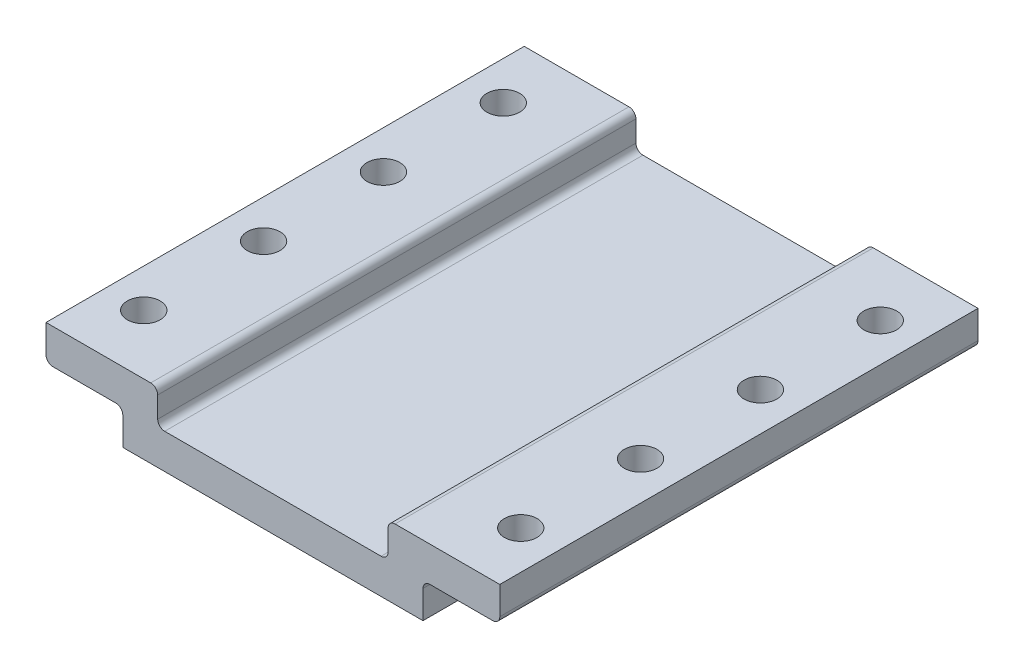
ISO-10303-21;
HEADER;
FILE_DESCRIPTION(('STEP AP214'),'2;1');
FILE_NAME('part.step','',(''),(''),'','','');
FILE_SCHEMA(('AUTOMOTIVE_DESIGN { 1 0 10303 214 1 1 1 1 }'));
ENDSEC;
DATA;
#1=APPLICATION_CONTEXT('core data for automotive mechanical design processes');
#2=APPLICATION_PROTOCOL_DEFINITION('international standard','automotive_design',2000,#1);
#3=PRODUCT_CONTEXT('',#1,'mechanical');
#4=PRODUCT('Part','Part','',(#3));
#5=PRODUCT_RELATED_PRODUCT_CATEGORY('part','',(#4));
#6=PRODUCT_DEFINITION_FORMATION('','',#4);
#7=PRODUCT_DEFINITION_CONTEXT('part definition',#1,'design');
#8=PRODUCT_DEFINITION('design','',#6,#7);
#9=PRODUCT_DEFINITION_SHAPE('','',#8);
#10=(LENGTH_UNIT() NAMED_UNIT(*) SI_UNIT(.MILLI.,.METRE.));
#11=(NAMED_UNIT(*) PLANE_ANGLE_UNIT() SI_UNIT($,.RADIAN.));
#12=(NAMED_UNIT(*) SI_UNIT($,.STERADIAN.) SOLID_ANGLE_UNIT());
#13=UNCERTAINTY_MEASURE_WITH_UNIT(LENGTH_MEASURE(1.E-05),#10,'distance_accuracy_value','');
#14=(GEOMETRIC_REPRESENTATION_CONTEXT(3) GLOBAL_UNCERTAINTY_ASSIGNED_CONTEXT((#13)) GLOBAL_UNIT_ASSIGNED_CONTEXT((#10,
#11,#12)) REPRESENTATION_CONTEXT('',''));
#15=CARTESIAN_POINT('',(0.,0.,0.));
#16=DIRECTION('',(0.,0.,1.));
#17=DIRECTION('',(1.,0.,0.));
#18=AXIS2_PLACEMENT_3D('',#15,#16,#17);
#19=CARTESIAN_POINT('',(-12.6060894386299,5.,-16.7354900095147));
#20=DIRECTION('',(1.,0.,0.));
#21=DIRECTION('',(0.,0.,-1.));
#22=AXIS2_PLACEMENT_3D('',#19,#20,#21);
#23=PLANE('',#22);
#24=DIRECTION('',(0.,-1.,0.));
#25=VECTOR('',#24,1.);
#26=CARTESIAN_POINT('',(-12.6060894386299,5.,51.7645099904853));
#27=LINE('',#26,#25);
#28=CARTESIAN_POINT('',(-12.6060894386299,4.,51.7645099904853));
#29=VERTEX_POINT('',#28);
#30=CARTESIAN_POINT('',(-12.6060894386299,0.,51.7645099904853));
#31=VERTEX_POINT('',#30);
#32=EDGE_CURVE('E315',#29,#31,#27,.T.);
#33=ORIENTED_EDGE('',*,*,#32,.F.);
#34=DIRECTION('',(0.,0.,1.));
#35=VECTOR('',#34,1.);
#36=CARTESIAN_POINT('',(-12.6060894386299,4.,-16.7354900095147));
#37=LINE('',#36,#35);
#38=CARTESIAN_POINT('',(-12.6060894386299,4.,-16.7354900095147));
#39=VERTEX_POINT('',#38);
#40=EDGE_CURVE('E392',#29,#39,#37,.F.);
#41=ORIENTED_EDGE('',*,*,#40,.T.);
#42=DIRECTION('',(0.,-1.,0.));
#43=VECTOR('',#42,1.);
#44=CARTESIAN_POINT('',(-12.6060894386299,5.,-16.7354900095147));
#45=LINE('',#44,#43);
#46=CARTESIAN_POINT('',(-12.6060894386299,0.,-16.7354900095147));
#47=VERTEX_POINT('',#46);
#48=EDGE_CURVE('E292',#39,#47,#45,.T.);
#49=ORIENTED_EDGE('',*,*,#48,.T.);
#50=DIRECTION('',(0.,0.,1.));
#51=VECTOR('',#50,1.);
#52=CARTESIAN_POINT('',(-12.6060894386299,0.,-16.7354900095147));
#53=LINE('',#52,#51);
#54=EDGE_CURVE('E282',#47,#31,#53,.T.);
#55=ORIENTED_EDGE('',*,*,#54,.T.);
#56=EDGE_LOOP('',(#33,#41,#49,#55));
#57=FACE_BOUND('',#56,.T.);
#58=ADVANCED_FACE('F44',(#57),#23,.F.);
#59=CARTESIAN_POINT('',(-12.6060894386299,5.,51.7645099904853));
#60=DIRECTION('',(0.,0.,-1.));
#61=DIRECTION('',(-1.,0.,0.));
#62=AXIS2_PLACEMENT_3D('',#59,#60,#61);
#63=PLANE('',#62);
#64=DIRECTION('',(-1.,0.,0.));
#65=VECTOR('',#64,1.);
#66=CARTESIAN_POINT('',(25.3939105613701,10.,51.7645099904853));
#67=LINE('',#66,#65);
#68=CARTESIAN_POINT('',(41.3939105613701,10.,51.7645099904853));
#69=VERTEX_POINT('',#68);
#70=CARTESIAN_POINT('',(26.3939105613701,10.,51.7645099904853));
#71=VERTEX_POINT('',#70);
#72=EDGE_CURVE('E185',#69,#71,#67,.T.);
#73=ORIENTED_EDGE('',*,*,#72,.T.);
#74=CARTESIAN_POINT('',(26.3939105613701,9.,51.7645099904853));
#75=DIRECTION('',(0.,0.,-1.));
#76=DIRECTION('',(-1.,0.,0.));
#77=AXIS2_PLACEMENT_3D('',#74,#75,#76);
#78=CIRCLE('',#77,1.);
#79=CARTESIAN_POINT('',(25.3939105613701,9.,51.7645099904853));
#80=VERTEX_POINT('',#79);
#81=EDGE_CURVE('E347',#71,#80,#78,.F.);
#82=ORIENTED_EDGE('',*,*,#81,.T.);
#83=DIRECTION('',(0.,-1.,0.));
#84=VECTOR('',#83,1.);
#85=CARTESIAN_POINT('',(25.3939105613701,10.,51.7645099904853));
#86=LINE('',#85,#84);
#87=CARTESIAN_POINT('',(25.3939105613701,6.,51.7645099904853));
#88=VERTEX_POINT('',#87);
#89=EDGE_CURVE('E193',#80,#88,#86,.T.);
#90=ORIENTED_EDGE('',*,*,#89,.T.);
#91=CARTESIAN_POINT('',(24.3939105613701,6.,51.7645099904853));
#92=DIRECTION('',(0.,0.,-1.));
#93=DIRECTION('',(-1.,0.,0.));
#94=AXIS2_PLACEMENT_3D('',#91,#92,#93);
#95=CIRCLE('',#94,1.);
#96=CARTESIAN_POINT('',(24.3939105613701,5.,51.7645099904853));
#97=VERTEX_POINT('',#96);
#98=EDGE_CURVE('E398',#88,#97,#95,.T.);
#99=ORIENTED_EDGE('',*,*,#98,.T.);
#100=DIRECTION('',(1.,0.,0.));
#101=VECTOR('',#100,1.);
#102=CARTESIAN_POINT('',(-12.6060894386299,5.,51.7645099904853));
#103=LINE('',#102,#101);
#104=CARTESIAN_POINT('',(-6.60608943862986,5.,51.7645099904853));
#105=VERTEX_POINT('',#104);
#106=EDGE_CURVE('E283',#105,#97,#103,.T.);
#107=ORIENTED_EDGE('',*,*,#106,.F.);
#108=CARTESIAN_POINT('',(-6.60608943862986,6.,51.7645099904853));
#109=DIRECTION('',(0.,0.,-1.));
#110=DIRECTION('',(-1.,0.,0.));
#111=AXIS2_PLACEMENT_3D('',#108,#109,#110);
#112=CIRCLE('',#111,1.);
#113=CARTESIAN_POINT('',(-7.60608943862986,6.,51.7645099904853));
#114=VERTEX_POINT('',#113);
#115=EDGE_CURVE('E404',#105,#114,#112,.T.);
#116=ORIENTED_EDGE('',*,*,#115,.T.);
#117=DIRECTION('',(0.,-1.,0.));
#118=VECTOR('',#117,1.);
#119=CARTESIAN_POINT('',(-7.60608943862986,10.,51.7645099904853));
#120=LINE('',#119,#118);
#121=CARTESIAN_POINT('',(-7.60608943862986,9.,51.7645099904853));
#122=VERTEX_POINT('',#121);
#123=EDGE_CURVE('E261',#122,#114,#120,.T.);
#124=ORIENTED_EDGE('',*,*,#123,.F.);
#125=CARTESIAN_POINT('',(-8.60608943862986,9.,51.7645099904853));
#126=DIRECTION('',(0.,0.,-1.));
#127=DIRECTION('',(-1.,0.,0.));
#128=AXIS2_PLACEMENT_3D('',#125,#126,#127);
#129=CIRCLE('',#128,1.);
#130=CARTESIAN_POINT('',(-8.60608943862986,10.,51.7645099904853));
#131=VERTEX_POINT('',#130);
#132=EDGE_CURVE('E344',#122,#131,#129,.F.);
#133=ORIENTED_EDGE('',*,*,#132,.T.);
#134=DIRECTION('',(1.,0.,0.));
#135=VECTOR('',#134,1.);
#136=CARTESIAN_POINT('',(-7.60608943862986,10.,51.7645099904853));
#137=LINE('',#136,#135);
#138=CARTESIAN_POINT('',(-23.6060894386299,10.,51.7645099904853));
#139=VERTEX_POINT('',#138);
#140=EDGE_CURVE('E257',#139,#131,#137,.T.);
#141=ORIENTED_EDGE('',*,*,#140,.F.);
#142=DIRECTION('',(0.,-1.,0.));
#143=VECTOR('',#142,1.);
#144=CARTESIAN_POINT('',(-23.6060894386299,10.,51.7645099904853));
#145=LINE('',#144,#143);
#146=CARTESIAN_POINT('',(-23.6060894386299,6.,51.7645099904853));
#147=VERTEX_POINT('',#146);
#148=EDGE_CURVE('E270',#139,#147,#145,.T.);
#149=ORIENTED_EDGE('',*,*,#148,.T.);
#150=CARTESIAN_POINT('',(-22.6060894386299,6.,51.7645099904853));
#151=DIRECTION('',(0.,0.,-1.));
#152=DIRECTION('',(-1.,0.,0.));
#153=AXIS2_PLACEMENT_3D('',#150,#151,#152);
#154=CIRCLE('',#153,1.);
#155=CARTESIAN_POINT('',(-22.6060894386299,5.,51.7645099904853));
#156=VERTEX_POINT('',#155);
#157=EDGE_CURVE('E339',#147,#156,#154,.F.);
#158=ORIENTED_EDGE('',*,*,#157,.T.);
#159=DIRECTION('',(1.,0.,0.));
#160=VECTOR('',#159,1.);
#161=CARTESIAN_POINT('',(-7.60608943862986,5.,51.7645099904853));
#162=LINE('',#161,#160);
#163=CARTESIAN_POINT('',(-13.6060894386299,5.,51.7645099904853));
#164=VERTEX_POINT('',#163);
#165=EDGE_CURVE('E254',#156,#164,#162,.T.);
#166=ORIENTED_EDGE('',*,*,#165,.T.);
#167=CARTESIAN_POINT('',(-13.6060894386299,4.,51.7645099904853));
#168=DIRECTION('',(0.,0.,-1.));
#169=DIRECTION('',(-1.,0.,0.));
#170=AXIS2_PLACEMENT_3D('',#167,#168,#169);
#171=CIRCLE('',#170,1.);
#172=EDGE_CURVE('E61',#164,#29,#171,.T.);
#173=ORIENTED_EDGE('',*,*,#172,.T.);
#174=ORIENTED_EDGE('',*,*,#32,.T.);
#175=DIRECTION('',(1.,0.,0.));
#176=VECTOR('',#175,1.);
#177=CARTESIAN_POINT('',(-12.6060894386299,0.,51.7645099904853));
#178=LINE('',#177,#176);
#179=CARTESIAN_POINT('',(30.3939105613701,0.,51.7645099904853));
#180=VERTEX_POINT('',#179);
#181=EDGE_CURVE('E296',#31,#180,#178,.T.);
#182=ORIENTED_EDGE('',*,*,#181,.T.);
#183=DIRECTION('',(0.,-1.,0.));
#184=VECTOR('',#183,1.);
#185=CARTESIAN_POINT('',(30.3939105613701,5.,51.7645099904853));
#186=LINE('',#185,#184);
#187=CARTESIAN_POINT('',(30.3939105613701,4.,51.7645099904853));
#188=VERTEX_POINT('',#187);
#189=EDGE_CURVE('E312',#188,#180,#186,.T.);
#190=ORIENTED_EDGE('',*,*,#189,.F.);
#191=CARTESIAN_POINT('',(31.3939105613701,4.,51.7645099904853));
#192=DIRECTION('',(0.,0.,-1.));
#193=DIRECTION('',(-1.,0.,0.));
#194=AXIS2_PLACEMENT_3D('',#191,#192,#193);
#195=CIRCLE('',#194,1.);
#196=CARTESIAN_POINT('',(31.3939105613701,5.,51.7645099904853));
#197=VERTEX_POINT('',#196);
#198=EDGE_CURVE('E410',#188,#197,#195,.T.);
#199=ORIENTED_EDGE('',*,*,#198,.T.);
#200=DIRECTION('',(-1.,0.,0.));
#201=VECTOR('',#200,1.);
#202=CARTESIAN_POINT('',(25.3939105613701,5.,51.7645099904853));
#203=LINE('',#202,#201);
#204=CARTESIAN_POINT('',(40.3939105613701,5.,51.7645099904853));
#205=VERTEX_POINT('',#204);
#206=EDGE_CURVE('E217',#205,#197,#203,.T.);
#207=ORIENTED_EDGE('',*,*,#206,.F.);
#208=CARTESIAN_POINT('',(40.3939105613701,6.,51.7645099904853));
#209=DIRECTION('',(0.,0.,-1.));
#210=DIRECTION('',(-1.,0.,0.));
#211=AXIS2_PLACEMENT_3D('',#208,#209,#210);
#212=CIRCLE('',#211,1.);
#213=CARTESIAN_POINT('',(41.3939105613701,6.,51.7645099904853));
#214=VERTEX_POINT('',#213);
#215=EDGE_CURVE('E188',#205,#214,#212,.F.);
#216=ORIENTED_EDGE('',*,*,#215,.T.);
#217=DIRECTION('',(0.,-1.,0.));
#218=VECTOR('',#217,1.);
#219=CARTESIAN_POINT('',(41.3939105613701,10.,51.7645099904853));
#220=LINE('',#219,#218);
#221=EDGE_CURVE('E182',#69,#214,#220,.T.);
#222=ORIENTED_EDGE('',*,*,#221,.F.);
#223=EDGE_LOOP('',(#73,#82,#90,#99,#107,#116,#124,#133,#141,#149,#158,#166,#173,#174,#182,#190,
#199,#207,#216,#222));
#224=FACE_BOUND('',#223,.T.);
#225=ADVANCED_FACE('F184',(#224),#63,.F.);
#226=CARTESIAN_POINT('',(30.3939105613701,5.,-16.7354900095147));
#227=DIRECTION('',(-1.,0.,0.));
#228=DIRECTION('',(0.,0.,1.));
#229=AXIS2_PLACEMENT_3D('',#226,#227,#228);
#230=PLANE('',#229);
#231=DIRECTION('',(0.,-1.,0.));
#232=VECTOR('',#231,1.);
#233=CARTESIAN_POINT('',(30.3939105613701,5.,-16.7354900095147));
#234=LINE('',#233,#232);
#235=CARTESIAN_POINT('',(30.3939105613701,4.,-16.7354900095147));
#236=VERTEX_POINT('',#235);
#237=CARTESIAN_POINT('',(30.3939105613701,0.,-16.7354900095147));
#238=VERTEX_POINT('',#237);
#239=EDGE_CURVE('E309',#236,#238,#234,.T.);
#240=ORIENTED_EDGE('',*,*,#239,.F.);
#241=DIRECTION('',(0.,0.,-1.));
#242=VECTOR('',#241,1.);
#243=CARTESIAN_POINT('',(30.3939105613701,4.,-16.7354900095147));
#244=LINE('',#243,#242);
#245=EDGE_CURVE('E379',#236,#188,#244,.F.);
#246=ORIENTED_EDGE('',*,*,#245,.T.);
#247=ORIENTED_EDGE('',*,*,#189,.T.);
#248=DIRECTION('',(0.,0.,-1.));
#249=VECTOR('',#248,1.);
#250=CARTESIAN_POINT('',(30.3939105613701,0.,-16.7354900095147));
#251=LINE('',#250,#249);
#252=EDGE_CURVE('E300',#180,#238,#251,.T.);
#253=ORIENTED_EDGE('',*,*,#252,.T.);
#254=EDGE_LOOP('',(#240,#246,#247,#253));
#255=FACE_BOUND('',#254,.T.);
#256=ADVANCED_FACE('F557',(#255),#230,.F.);
#257=CARTESIAN_POINT('',(-12.6060894386299,5.,-16.7354900095147));
#258=DIRECTION('',(0.,0.,1.));
#259=DIRECTION('',(1.,0.,0.));
#260=AXIS2_PLACEMENT_3D('',#257,#258,#259);
#261=PLANE('',#260);
#262=DIRECTION('',(0.,-1.,0.));
#263=VECTOR('',#262,1.);
#264=CARTESIAN_POINT('',(25.3939105613701,10.,-16.7354900095148));
#265=LINE('',#264,#263);
#266=CARTESIAN_POINT('',(25.3939105613701,9.,-16.7354900095148));
#267=VERTEX_POINT('',#266);
#268=CARTESIAN_POINT('',(25.3939105613701,6.,-16.7354900095148));
#269=VERTEX_POINT('',#268);
#270=EDGE_CURVE('E213',#267,#269,#265,.T.);
#271=ORIENTED_EDGE('',*,*,#270,.F.);
#272=CARTESIAN_POINT('',(26.3939105613701,9.,-16.7354900095147));
#273=DIRECTION('',(0.,0.,1.));
#274=DIRECTION('',(1.,0.,0.));
#275=AXIS2_PLACEMENT_3D('',#272,#273,#274);
#276=CIRCLE('',#275,1.);
#277=CARTESIAN_POINT('',(26.3939105613701,10.,-16.7354900095148));
#278=VERTEX_POINT('',#277);
#279=EDGE_CURVE('E334',#267,#278,#276,.F.);
#280=ORIENTED_EDGE('',*,*,#279,.T.);
#281=DIRECTION('',(1.,0.,0.));
#282=VECTOR('',#281,1.);
#283=CARTESIAN_POINT('',(25.3939105613701,10.,-16.7354900095148));
#284=LINE('',#283,#282);
#285=CARTESIAN_POINT('',(41.3939105613701,10.,-16.7354900095148));
#286=VERTEX_POINT('',#285);
#287=EDGE_CURVE('E210',#278,#286,#284,.T.);
#288=ORIENTED_EDGE('',*,*,#287,.T.);
#289=DIRECTION('',(0.,-1.,0.));
#290=VECTOR('',#289,1.);
#291=CARTESIAN_POINT('',(41.3939105613701,10.,-16.7354900095148));
#292=LINE('',#291,#290);
#293=CARTESIAN_POINT('',(41.3939105613701,6.,-16.7354900095148));
#294=VERTEX_POINT('',#293);
#295=EDGE_CURVE('E194',#286,#294,#292,.T.);
#296=ORIENTED_EDGE('',*,*,#295,.T.);
#297=CARTESIAN_POINT('',(40.3939105613701,6.,-16.7354900095147));
#298=DIRECTION('',(0.,0.,1.));
#299=DIRECTION('',(1.,0.,0.));
#300=AXIS2_PLACEMENT_3D('',#297,#298,#299);
#301=CIRCLE('',#300,1.);
#302=CARTESIAN_POINT('',(40.3939105613701,5.,-16.7354900095148));
#303=VERTEX_POINT('',#302);
#304=EDGE_CURVE('E328',#294,#303,#301,.F.);
#305=ORIENTED_EDGE('',*,*,#304,.T.);
#306=DIRECTION('',(1.,0.,0.));
#307=VECTOR('',#306,1.);
#308=CARTESIAN_POINT('',(25.3939105613701,5.,-16.7354900095148));
#309=LINE('',#308,#307);
#310=CARTESIAN_POINT('',(31.3939105613701,5.,-16.7354900095148));
#311=VERTEX_POINT('',#310);
#312=EDGE_CURVE('E204',#311,#303,#309,.T.);
#313=ORIENTED_EDGE('',*,*,#312,.F.);
#314=CARTESIAN_POINT('',(31.3939105613701,4.,-16.7354900095147));
#315=DIRECTION('',(0.,0.,1.));
#316=DIRECTION('',(1.,0.,0.));
#317=AXIS2_PLACEMENT_3D('',#314,#315,#316);
#318=CIRCLE('',#317,1.);
#319=EDGE_CURVE('E407',#311,#236,#318,.T.);
#320=ORIENTED_EDGE('',*,*,#319,.T.);
#321=ORIENTED_EDGE('',*,*,#239,.T.);
#322=DIRECTION('',(-1.,0.,0.));
#323=VECTOR('',#322,1.);
#324=CARTESIAN_POINT('',(-12.6060894386299,0.,-16.7354900095147));
#325=LINE('',#324,#323);
#326=EDGE_CURVE('E288',#238,#47,#325,.T.);
#327=ORIENTED_EDGE('',*,*,#326,.T.);
#328=ORIENTED_EDGE('',*,*,#48,.F.);
#329=CARTESIAN_POINT('',(-13.6060894386299,4.,-16.7354900095147));
#330=DIRECTION('',(0.,0.,1.));
#331=DIRECTION('',(1.,0.,0.));
#332=AXIS2_PLACEMENT_3D('',#329,#330,#331);
#333=CIRCLE('',#332,1.);
#334=CARTESIAN_POINT('',(-13.6060894386299,5.,-16.7354900095147));
#335=VERTEX_POINT('',#334);
#336=EDGE_CURVE('E415',#39,#335,#333,.T.);
#337=ORIENTED_EDGE('',*,*,#336,.T.);
#338=DIRECTION('',(-1.,0.,0.));
#339=VECTOR('',#338,1.);
#340=CARTESIAN_POINT('',(-7.60608943862987,5.,-16.7354900095147));
#341=LINE('',#340,#339);
#342=CARTESIAN_POINT('',(-22.6060894386299,5.,-16.7354900095147));
#343=VERTEX_POINT('',#342);
#344=EDGE_CURVE('E238',#335,#343,#341,.T.);
#345=ORIENTED_EDGE('',*,*,#344,.T.);
#346=CARTESIAN_POINT('',(-22.6060894386299,6.,-16.7354900095147));
#347=DIRECTION('',(0.,0.,1.));
#348=DIRECTION('',(1.,0.,0.));
#349=AXIS2_PLACEMENT_3D('',#346,#347,#348);
#350=CIRCLE('',#349,1.);
#351=CARTESIAN_POINT('',(-23.6060894386299,6.,-16.7354900095147));
#352=VERTEX_POINT('',#351);
#353=EDGE_CURVE('E325',#343,#352,#350,.F.);
#354=ORIENTED_EDGE('',*,*,#353,.T.);
#355=DIRECTION('',(0.,-1.,0.));
#356=VECTOR('',#355,1.);
#357=CARTESIAN_POINT('',(-23.6060894386299,10.,-16.7354900095147));
#358=LINE('',#357,#356);
#359=CARTESIAN_POINT('',(-23.6060894386299,10.,-16.7354900095147));
#360=VERTEX_POINT('',#359);
#361=EDGE_CURVE('E274',#360,#352,#358,.T.);
#362=ORIENTED_EDGE('',*,*,#361,.F.);
#363=DIRECTION('',(-1.,0.,0.));
#364=VECTOR('',#363,1.);
#365=CARTESIAN_POINT('',(-7.60608943862987,10.,-16.7354900095147));
#366=LINE('',#365,#364);
#367=CARTESIAN_POINT('',(-8.60608943862987,10.,-16.7354900095147));
#368=VERTEX_POINT('',#367);
#369=EDGE_CURVE('E250',#368,#360,#366,.T.);
#370=ORIENTED_EDGE('',*,*,#369,.F.);
#371=CARTESIAN_POINT('',(-8.60608943862987,9.,-16.7354900095147));
#372=DIRECTION('',(0.,0.,1.));
#373=DIRECTION('',(1.,0.,0.));
#374=AXIS2_PLACEMENT_3D('',#371,#372,#373);
#375=CIRCLE('',#374,1.);
#376=CARTESIAN_POINT('',(-7.60608943862987,9.,-16.7354900095147));
#377=VERTEX_POINT('',#376);
#378=EDGE_CURVE('E331',#368,#377,#375,.F.);
#379=ORIENTED_EDGE('',*,*,#378,.T.);
#380=DIRECTION('',(0.,-1.,0.));
#381=VECTOR('',#380,1.);
#382=CARTESIAN_POINT('',(-7.60608943862987,10.,-16.7354900095147));
#383=LINE('',#382,#381);
#384=CARTESIAN_POINT('',(-7.60608943862987,6.,-16.7354900095147));
#385=VERTEX_POINT('',#384);
#386=EDGE_CURVE('E278',#377,#385,#383,.T.);
#387=ORIENTED_EDGE('',*,*,#386,.T.);
#388=CARTESIAN_POINT('',(-6.60608943862987,6.,-16.7354900095147));
#389=DIRECTION('',(0.,0.,1.));
#390=DIRECTION('',(1.,0.,0.));
#391=AXIS2_PLACEMENT_3D('',#388,#389,#390);
#392=CIRCLE('',#391,1.);
#393=CARTESIAN_POINT('',(-6.60608943862987,5.,-16.7354900095147));
#394=VERTEX_POINT('',#393);
#395=EDGE_CURVE('E401',#385,#394,#392,.T.);
#396=ORIENTED_EDGE('',*,*,#395,.T.);
#397=DIRECTION('',(-1.,0.,0.));
#398=VECTOR('',#397,1.);
#399=CARTESIAN_POINT('',(-12.6060894386299,5.,-16.7354900095147));
#400=LINE('',#399,#398);
#401=CARTESIAN_POINT('',(24.3939105613701,5.,-16.7354900095147));
#402=VERTEX_POINT('',#401);
#403=EDGE_CURVE('E287',#402,#394,#400,.T.);
#404=ORIENTED_EDGE('',*,*,#403,.F.);
#405=CARTESIAN_POINT('',(24.3939105613701,6.,-16.7354900095147));
#406=DIRECTION('',(0.,0.,1.));
#407=DIRECTION('',(1.,0.,0.));
#408=AXIS2_PLACEMENT_3D('',#405,#406,#407);
#409=CIRCLE('',#408,1.);
#410=EDGE_CURVE('E395',#402,#269,#409,.T.);
#411=ORIENTED_EDGE('',*,*,#410,.T.);
#412=EDGE_LOOP('',(#271,#280,#288,#296,#305,#313,#320,#321,#327,#328,#337,#345,#354,#362,#370,
#379,#387,#396,#404,#411));
#413=FACE_BOUND('',#412,.T.);
#414=ADVANCED_FACE('F505',(#413),#261,.F.);
#415=CARTESIAN_POINT('',(0.,5.,0.));
#416=DIRECTION('',(0.,1.,0.));
#417=DIRECTION('',(0.,0.,1.));
#418=AXIS2_PLACEMENT_3D('',#415,#416,#417);
#419=PLANE('',#418);
#420=ORIENTED_EDGE('',*,*,#106,.T.);
#421=DIRECTION('',(0.,0.,-1.));
#422=VECTOR('',#421,1.);
#423=CARTESIAN_POINT('',(24.3939105613701,5.,-16.7354900095148));
#424=LINE('',#423,#422);
#425=EDGE_CURVE('E364',#97,#402,#424,.T.);
#426=ORIENTED_EDGE('',*,*,#425,.T.);
#427=ORIENTED_EDGE('',*,*,#403,.T.);
#428=DIRECTION('',(0.,0.,-1.));
#429=VECTOR('',#428,1.);
#430=CARTESIAN_POINT('',(-6.60608943862987,5.,0.));
#431=LINE('',#430,#429);
#432=EDGE_CURVE('E361',#394,#105,#431,.F.);
#433=ORIENTED_EDGE('',*,*,#432,.T.);
#434=EDGE_LOOP('',(#420,#426,#427,#433));
#435=FACE_BOUND('',#434,.T.);
#436=ADVANCED_FACE('F530',(#435),#419,.T.);
#437=CARTESIAN_POINT('',(0.,0.,0.));
#438=DIRECTION('',(0.,1.,0.));
#439=DIRECTION('',(0.,0.,1.));
#440=AXIS2_PLACEMENT_3D('',#437,#438,#439);
#441=PLANE('',#440);
#442=ORIENTED_EDGE('',*,*,#54,.F.);
#443=ORIENTED_EDGE('',*,*,#326,.F.);
#444=ORIENTED_EDGE('',*,*,#252,.F.);
#445=ORIENTED_EDGE('',*,*,#181,.F.);
#446=EDGE_LOOP('',(#442,#443,#444,#445));
#447=FACE_BOUND('',#446,.T.);
#448=ADVANCED_FACE('F563',(#447),#441,.F.);
#449=CARTESIAN_POINT('',(-7.60608943862987,10.,-16.7354900095147));
#450=DIRECTION('',(-1.,0.,0.));
#451=DIRECTION('',(0.,0.,1.));
#452=AXIS2_PLACEMENT_3D('',#449,#450,#451);
#453=PLANE('',#452);
#454=ORIENTED_EDGE('',*,*,#386,.F.);
#455=DIRECTION('',(0.,0.,-1.));
#456=VECTOR('',#455,1.);
#457=CARTESIAN_POINT('',(-7.60608943862987,9.,-16.7354900095147));
#458=LINE('',#457,#456);
#459=EDGE_CURVE('E358',#377,#122,#458,.F.);
#460=ORIENTED_EDGE('',*,*,#459,.T.);
#461=ORIENTED_EDGE('',*,*,#123,.T.);
#462=DIRECTION('',(0.,0.,-1.));
#463=VECTOR('',#462,1.);
#464=CARTESIAN_POINT('',(-7.60608943862987,6.,-16.7354900095147));
#465=LINE('',#464,#463);
#466=EDGE_CURVE('E354',#114,#385,#465,.T.);
#467=ORIENTED_EDGE('',*,*,#466,.T.);
#468=EDGE_LOOP('',(#454,#460,#461,#467));
#469=FACE_BOUND('',#468,.T.);
#470=ADVANCED_FACE('F518',(#469),#453,.F.);
#471=CARTESIAN_POINT('',(-23.6060894386299,10.,-16.7354900095147));
#472=DIRECTION('',(1.,0.,0.));
#473=DIRECTION('',(0.,0.,-1.));
#474=AXIS2_PLACEMENT_3D('',#471,#472,#473);
#475=PLANE('',#474);
#476=ORIENTED_EDGE('',*,*,#361,.T.);
#477=DIRECTION('',(0.,0.,1.));
#478=VECTOR('',#477,1.);
#479=CARTESIAN_POINT('',(-23.6060894386299,6.,51.7645099904853));
#480=LINE('',#479,#478);
#481=EDGE_CURVE('E382',#352,#147,#480,.T.);
#482=ORIENTED_EDGE('',*,*,#481,.T.);
#483=ORIENTED_EDGE('',*,*,#148,.F.);
#484=DIRECTION('',(0.,0.,1.));
#485=VECTOR('',#484,1.);
#486=CARTESIAN_POINT('',(-23.6060894386299,10.,-16.7354900095147));
#487=LINE('',#486,#485);
#488=EDGE_CURVE('E253',#360,#139,#487,.T.);
#489=ORIENTED_EDGE('',*,*,#488,.F.);
#490=EDGE_LOOP('',(#476,#482,#483,#489));
#491=FACE_BOUND('',#490,.T.);
#492=ADVANCED_FACE('F509',(#491),#475,.F.);
#493=CARTESIAN_POINT('',(0.,10.,0.));
#494=DIRECTION('',(0.,-1.,0.));
#495=DIRECTION('',(0.,0.,-1.));
#496=AXIS2_PLACEMENT_3D('',#493,#494,#495);
#497=PLANE('',#496);
#498=CARTESIAN_POINT('',(-18.1060894386299,10.,-8.23549000951475));
#499=DIRECTION('',(0.,1.,0.));
#500=DIRECTION('',(0.,0.,1.));
#501=AXIS2_PLACEMENT_3D('',#498,#499,#500);
#502=CIRCLE('',#501,2.35);
#503=CARTESIAN_POINT('',(-18.1060894386299,10.,-5.88549000951475));
#504=VERTEX_POINT('',#503);
#505=EDGE_CURVE('E234',#504,#504,#502,.T.);
#506=ORIENTED_EDGE('',*,*,#505,.F.);
#507=EDGE_LOOP('',(#506));
#508=FACE_BOUND('',#507,.T.);
#509=CARTESIAN_POINT('',(-18.1060894386299,10.,8.93117665715192));
#510=DIRECTION('',(0.,1.,0.));
#511=DIRECTION('',(0.,0.,1.));
#512=AXIS2_PLACEMENT_3D('',#509,#510,#511);
#513=CIRCLE('',#512,2.35);
#514=CARTESIAN_POINT('',(-18.1060894386299,10.,11.2811766571519));
#515=VERTEX_POINT('',#514);
#516=EDGE_CURVE('E239',#515,#515,#513,.T.);
#517=ORIENTED_EDGE('',*,*,#516,.F.);
#518=EDGE_LOOP('',(#517));
#519=FACE_BOUND('',#518,.T.);
#520=CARTESIAN_POINT('',(-18.1060894386299,10.,26.0978433238186));
#521=DIRECTION('',(0.,1.,0.));
#522=DIRECTION('',(0.,0.,1.));
#523=AXIS2_PLACEMENT_3D('',#520,#521,#522);
#524=CIRCLE('',#523,2.35);
#525=CARTESIAN_POINT('',(-18.1060894386299,10.,28.4478433238186));
#526=VERTEX_POINT('',#525);
#527=EDGE_CURVE('E243',#526,#526,#524,.T.);
#528=ORIENTED_EDGE('',*,*,#527,.F.);
#529=EDGE_LOOP('',(#528));
#530=FACE_BOUND('',#529,.T.);
#531=CARTESIAN_POINT('',(-18.1060894386299,10.,43.2645099904853));
#532=DIRECTION('',(0.,1.,0.));
#533=DIRECTION('',(0.,0.,1.));
#534=AXIS2_PLACEMENT_3D('',#531,#532,#533);
#535=CIRCLE('',#534,2.35);
#536=CARTESIAN_POINT('',(-18.1060894386299,10.,45.6145099904853));
#537=VERTEX_POINT('',#536);
#538=EDGE_CURVE('E233',#537,#537,#535,.T.);
#539=ORIENTED_EDGE('',*,*,#538,.F.);
#540=EDGE_LOOP('',(#539));
#541=FACE_BOUND('',#540,.T.);
#542=ORIENTED_EDGE('',*,*,#140,.T.);
#543=DIRECTION('',(0.,0.,-1.));
#544=VECTOR('',#543,1.);
#545=CARTESIAN_POINT('',(-8.60608943862987,10.,0.));
#546=LINE('',#545,#544);
#547=EDGE_CURVE('E350',#131,#368,#546,.T.);
#548=ORIENTED_EDGE('',*,*,#547,.T.);
#549=ORIENTED_EDGE('',*,*,#369,.T.);
#550=ORIENTED_EDGE('',*,*,#488,.T.);
#551=EDGE_LOOP('',(#542,#548,#549,#550));
#552=FACE_BOUND('',#551,.T.);
#553=ADVANCED_FACE('F490',(#508,#519,#530,#541,#552),#497,.F.);
#554=CARTESIAN_POINT('',(0.,5.,0.));
#555=DIRECTION('',(0.,-1.,0.));
#556=DIRECTION('',(0.,0.,-1.));
#557=AXIS2_PLACEMENT_3D('',#554,#555,#556);
#558=PLANE('',#557);
#559=CARTESIAN_POINT('',(-18.1060894386299,5.,-8.23549000951475));
#560=DIRECTION('',(0.,-1.,0.));
#561=DIRECTION('',(0.,0.,-1.));
#562=AXIS2_PLACEMENT_3D('',#559,#560,#561);
#563=CIRCLE('',#562,3.35000000000001);
#564=CARTESIAN_POINT('',(-18.1060894386299,5.,-11.5854900095148));
#565=VERTEX_POINT('',#564);
#566=EDGE_CURVE('E462',#565,#565,#563,.F.);
#567=ORIENTED_EDGE('',*,*,#566,.T.);
#568=EDGE_LOOP('',(#567));
#569=FACE_BOUND('',#568,.T.);
#570=CARTESIAN_POINT('',(-18.1060894386299,5.,8.93117665715192));
#571=DIRECTION('',(0.,-1.,0.));
#572=DIRECTION('',(0.,0.,-1.));
#573=AXIS2_PLACEMENT_3D('',#570,#571,#572);
#574=CIRCLE('',#573,3.35000000000001);
#575=CARTESIAN_POINT('',(-18.1060894386299,5.,5.58117665715191));
#576=VERTEX_POINT('',#575);
#577=EDGE_CURVE('E458',#576,#576,#574,.F.);
#578=ORIENTED_EDGE('',*,*,#577,.T.);
#579=EDGE_LOOP('',(#578));
#580=FACE_BOUND('',#579,.T.);
#581=CARTESIAN_POINT('',(-18.1060894386299,5.,26.0978433238186));
#582=DIRECTION('',(0.,-1.,0.));
#583=DIRECTION('',(0.,0.,-1.));
#584=AXIS2_PLACEMENT_3D('',#581,#582,#583);
#585=CIRCLE('',#584,3.35000000000001);
#586=CARTESIAN_POINT('',(-18.1060894386299,5.,22.7478433238186));
#587=VERTEX_POINT('',#586);
#588=EDGE_CURVE('E454',#587,#587,#585,.F.);
#589=ORIENTED_EDGE('',*,*,#588,.T.);
#590=EDGE_LOOP('',(#589));
#591=FACE_BOUND('',#590,.T.);
#592=CARTESIAN_POINT('',(-18.1060894386299,5.,43.2645099904853));
#593=DIRECTION('',(0.,-1.,0.));
#594=DIRECTION('',(0.,0.,-1.));
#595=AXIS2_PLACEMENT_3D('',#592,#593,#594);
#596=CIRCLE('',#595,3.35000000000001);
#597=CARTESIAN_POINT('',(-18.1060894386299,5.,39.9145099904853));
#598=VERTEX_POINT('',#597);
#599=EDGE_CURVE('E450',#598,#598,#596,.F.);
#600=ORIENTED_EDGE('',*,*,#599,.T.);
#601=EDGE_LOOP('',(#600));
#602=FACE_BOUND('',#601,.T.);
#603=ORIENTED_EDGE('',*,*,#165,.F.);
#604=DIRECTION('',(0.,0.,1.));
#605=VECTOR('',#604,1.);
#606=CARTESIAN_POINT('',(-22.6060894386299,5.,-16.7354900095147));
#607=LINE('',#606,#605);
#608=EDGE_CURVE('E389',#156,#343,#607,.F.);
#609=ORIENTED_EDGE('',*,*,#608,.T.);
#610=ORIENTED_EDGE('',*,*,#344,.F.);
#611=DIRECTION('',(0.,0.,1.));
#612=VECTOR('',#611,1.);
#613=CARTESIAN_POINT('',(-13.6060894386299,5.,0.));
#614=LINE('',#613,#612);
#615=EDGE_CURVE('E386',#335,#164,#614,.T.);
#616=ORIENTED_EDGE('',*,*,#615,.T.);
#617=EDGE_LOOP('',(#603,#609,#610,#616));
#618=FACE_BOUND('',#617,.T.);
#619=ADVANCED_FACE('F486',(#569,#580,#591,#602,#618),#558,.T.);
#620=CARTESIAN_POINT('',(-18.1060894386299,-0.000999999999999265,43.2645099904853));
#621=DIRECTION('',(0.,1.,0.));
#622=DIRECTION('',(0.,0.,1.));
#623=AXIS2_PLACEMENT_3D('',#620,#621,#622);
#624=CYLINDRICAL_SURFACE('',#623,2.35);
#625=CARTESIAN_POINT('',(-18.1060894386299,6.00000000000003,43.2645099904853));
#626=DIRECTION('',(0.,-1.,0.));
#627=DIRECTION('',(0.,0.,-1.));
#628=AXIS2_PLACEMENT_3D('',#625,#626,#627);
#629=CIRCLE('',#628,2.35);
#630=CARTESIAN_POINT('',(-18.1060894386299,6.00000000000003,40.9145099904853));
#631=VERTEX_POINT('',#630);
#632=EDGE_CURVE('E11',#631,#631,#629,.T.);
#633=ORIENTED_EDGE('',*,*,#632,.T.);
#634=EDGE_LOOP('',(#633));
#635=FACE_BOUND('',#634,.T.);
#636=ORIENTED_EDGE('',*,*,#538,.T.);
#637=EDGE_LOOP('',(#636));
#638=FACE_BOUND('',#637,.T.);
#639=ADVANCED_FACE('F489',(#635,#638),#624,.F.);
#640=CARTESIAN_POINT('',(-18.1060894386299,-0.000999999999999265,26.0978433238186));
#641=DIRECTION('',(0.,1.,0.));
#642=DIRECTION('',(0.,0.,1.));
#643=AXIS2_PLACEMENT_3D('',#640,#641,#642);
#644=CYLINDRICAL_SURFACE('',#643,2.35);
#645=CARTESIAN_POINT('',(-18.1060894386299,6.00000000000001,26.0978433238186));
#646=DIRECTION('',(0.,-1.,0.));
#647=DIRECTION('',(0.,0.,-1.));
#648=AXIS2_PLACEMENT_3D('',#645,#646,#647);
#649=CIRCLE('',#648,2.35);
#650=CARTESIAN_POINT('',(-18.1060894386299,6.00000000000001,23.7478433238186));
#651=VERTEX_POINT('',#650);
#652=EDGE_CURVE('E54',#651,#651,#649,.T.);
#653=ORIENTED_EDGE('',*,*,#652,.T.);
#654=EDGE_LOOP('',(#653));
#655=FACE_BOUND('',#654,.T.);
#656=ORIENTED_EDGE('',*,*,#527,.T.);
#657=EDGE_LOOP('',(#656));
#658=FACE_BOUND('',#657,.T.);
#659=ADVANCED_FACE('F477',(#655,#658),#644,.F.);
#660=CARTESIAN_POINT('',(-18.1060894386299,-0.000999999999999265,8.93117665715192));
#661=DIRECTION('',(0.,1.,0.));
#662=DIRECTION('',(0.,0.,1.));
#663=AXIS2_PLACEMENT_3D('',#660,#661,#662);
#664=CYLINDRICAL_SURFACE('',#663,2.35);
#665=CARTESIAN_POINT('',(-18.1060894386299,6.00000000000001,8.93117665715192));
#666=DIRECTION('',(0.,-1.,0.));
#667=DIRECTION('',(0.,0.,-1.));
#668=AXIS2_PLACEMENT_3D('',#665,#666,#667);
#669=CIRCLE('',#668,2.35);
#670=CARTESIAN_POINT('',(-18.1060894386299,6.00000000000001,6.58117665715192));
#671=VERTEX_POINT('',#670);
#672=EDGE_CURVE('E470',#671,#671,#669,.T.);
#673=ORIENTED_EDGE('',*,*,#672,.T.);
#674=EDGE_LOOP('',(#673));
#675=FACE_BOUND('',#674,.T.);
#676=ORIENTED_EDGE('',*,*,#516,.T.);
#677=EDGE_LOOP('',(#676));
#678=FACE_BOUND('',#677,.T.);
#679=ADVANCED_FACE('F645',(#675,#678),#664,.F.);
#680=CARTESIAN_POINT('',(-18.1060894386299,-0.000999999999999265,-8.23549000951475));
#681=DIRECTION('',(0.,1.,0.));
#682=DIRECTION('',(0.,0.,1.));
#683=AXIS2_PLACEMENT_3D('',#680,#681,#682);
#684=CYLINDRICAL_SURFACE('',#683,2.35);
#685=CARTESIAN_POINT('',(-18.1060894386299,6.00000000000001,-8.23549000951475));
#686=DIRECTION('',(0.,-1.,0.));
#687=DIRECTION('',(0.,0.,-1.));
#688=AXIS2_PLACEMENT_3D('',#685,#686,#687);
#689=CIRCLE('',#688,2.35);
#690=CARTESIAN_POINT('',(-18.1060894386299,6.00000000000001,-10.5854900095147));
#691=VERTEX_POINT('',#690);
#692=EDGE_CURVE('E466',#691,#691,#689,.T.);
#693=ORIENTED_EDGE('',*,*,#692,.T.);
#694=EDGE_LOOP('',(#693));
#695=FACE_BOUND('',#694,.T.);
#696=ORIENTED_EDGE('',*,*,#505,.T.);
#697=EDGE_LOOP('',(#696));
#698=FACE_BOUND('',#697,.T.);
#699=ADVANCED_FACE('F648',(#695,#698),#684,.F.);
#700=CARTESIAN_POINT('',(17.7878211227403,5.,0.));
#701=DIRECTION('',(0.,-1.,0.));
#702=DIRECTION('',(0.,0.,-1.));
#703=AXIS2_PLACEMENT_3D('',#700,#701,#702);
#704=PLANE('',#703);
#705=CARTESIAN_POINT('',(35.8939105613701,5.,-8.23549000951475));
#706=DIRECTION('',(0.,-1.,0.));
#707=DIRECTION('',(0.,0.,-1.));
#708=AXIS2_PLACEMENT_3D('',#705,#706,#707);
#709=CIRCLE('',#708,3.34999999999998);
#710=CARTESIAN_POINT('',(35.8939105613701,5.,-11.5854900095147));
#711=VERTEX_POINT('',#710);
#712=EDGE_CURVE('E434',#711,#711,#709,.F.);
#713=ORIENTED_EDGE('',*,*,#712,.T.);
#714=EDGE_LOOP('',(#713));
#715=FACE_BOUND('',#714,.T.);
#716=CARTESIAN_POINT('',(35.8939105613701,5.,8.93117665715191));
#717=DIRECTION('',(0.,-1.,0.));
#718=DIRECTION('',(0.,0.,-1.));
#719=AXIS2_PLACEMENT_3D('',#716,#717,#718);
#720=CIRCLE('',#719,3.34999999999998);
#721=CARTESIAN_POINT('',(35.8939105613701,5.,5.58117665715194));
#722=VERTEX_POINT('',#721);
#723=EDGE_CURVE('E430',#722,#722,#720,.F.);
#724=ORIENTED_EDGE('',*,*,#723,.T.);
#725=EDGE_LOOP('',(#724));
#726=FACE_BOUND('',#725,.T.);
#727=CARTESIAN_POINT('',(35.8939105613701,5.,26.0978433238186));
#728=DIRECTION('',(0.,-1.,0.));
#729=DIRECTION('',(0.,0.,-1.));
#730=AXIS2_PLACEMENT_3D('',#727,#728,#729);
#731=CIRCLE('',#730,3.35000000000001);
#732=CARTESIAN_POINT('',(35.8939105613701,5.,22.7478433238186));
#733=VERTEX_POINT('',#732);
#734=EDGE_CURVE('E426',#733,#733,#731,.F.);
#735=ORIENTED_EDGE('',*,*,#734,.T.);
#736=EDGE_LOOP('',(#735));
#737=FACE_BOUND('',#736,.T.);
#738=CARTESIAN_POINT('',(35.8939105613701,5.,43.2645099904853));
#739=DIRECTION('',(0.,-1.,0.));
#740=DIRECTION('',(0.,0.,-1.));
#741=AXIS2_PLACEMENT_3D('',#738,#739,#740);
#742=CIRCLE('',#741,3.35000000000001);
#743=CARTESIAN_POINT('',(35.8939105613701,5.,39.9145099904852));
#744=VERTEX_POINT('',#743);
#745=EDGE_CURVE('E422',#744,#744,#742,.F.);
#746=ORIENTED_EDGE('',*,*,#745,.T.);
#747=EDGE_LOOP('',(#746));
#748=FACE_BOUND('',#747,.T.);
#749=ORIENTED_EDGE('',*,*,#312,.T.);
#750=DIRECTION('',(0.,0.,1.));
#751=VECTOR('',#750,1.);
#752=CARTESIAN_POINT('',(40.3939105613701,5.,0.));
#753=LINE('',#752,#751);
#754=EDGE_CURVE('E372',#303,#205,#753,.T.);
#755=ORIENTED_EDGE('',*,*,#754,.T.);
#756=ORIENTED_EDGE('',*,*,#206,.T.);
#757=DIRECTION('',(0.,0.,-1.));
#758=VECTOR('',#757,1.);
#759=CARTESIAN_POINT('',(31.3939105613701,5.,0.));
#760=LINE('',#759,#758);
#761=EDGE_CURVE('E368',#197,#311,#760,.T.);
#762=ORIENTED_EDGE('',*,*,#761,.T.);
#763=EDGE_LOOP('',(#749,#755,#756,#762));
#764=FACE_BOUND('',#763,.T.);
#765=ADVANCED_FACE('F548',(#715,#726,#737,#748,#764),#704,.T.);
#766=CARTESIAN_POINT('',(25.3939105613701,10.,-16.7354900095148));
#767=DIRECTION('',(-1.,0.,0.));
#768=DIRECTION('',(0.,0.,1.));
#769=AXIS2_PLACEMENT_3D('',#766,#767,#768);
#770=PLANE('',#769);
#771=ORIENTED_EDGE('',*,*,#89,.F.);
#772=DIRECTION('',(0.,0.,-1.));
#773=VECTOR('',#772,1.);
#774=CARTESIAN_POINT('',(25.3939105613701,9.,-16.7354900095148));
#775=LINE('',#774,#773);
#776=EDGE_CURVE('E321',#80,#267,#775,.T.);
#777=ORIENTED_EDGE('',*,*,#776,.T.);
#778=ORIENTED_EDGE('',*,*,#270,.T.);
#779=DIRECTION('',(0.,0.,-1.));
#780=VECTOR('',#779,1.);
#781=CARTESIAN_POINT('',(25.3939105613701,6.,51.7645099904853));
#782=LINE('',#781,#780);
#783=EDGE_CURVE('E318',#269,#88,#782,.F.);
#784=ORIENTED_EDGE('',*,*,#783,.T.);
#785=EDGE_LOOP('',(#771,#777,#778,#784));
#786=FACE_BOUND('',#785,.T.);
#787=ADVANCED_FACE('F538',(#786),#770,.T.);
#788=CARTESIAN_POINT('',(41.3939105613701,10.,-16.7354900095148));
#789=DIRECTION('',(1.,0.,0.));
#790=DIRECTION('',(0.,0.,-1.));
#791=AXIS2_PLACEMENT_3D('',#788,#789,#790);
#792=PLANE('',#791);
#793=ORIENTED_EDGE('',*,*,#221,.T.);
#794=DIRECTION('',(0.,0.,1.));
#795=VECTOR('',#794,1.);
#796=CARTESIAN_POINT('',(41.3939105613701,6.,-16.7354900095148));
#797=LINE('',#796,#795);
#798=EDGE_CURVE('E376',#214,#294,#797,.F.);
#799=ORIENTED_EDGE('',*,*,#798,.T.);
#800=ORIENTED_EDGE('',*,*,#295,.F.);
#801=DIRECTION('',(0.,0.,1.));
#802=VECTOR('',#801,1.);
#803=CARTESIAN_POINT('',(41.3939105613701,10.,-16.7354900095148));
#804=LINE('',#803,#802);
#805=EDGE_CURVE('E200',#286,#69,#804,.T.);
#806=ORIENTED_EDGE('',*,*,#805,.T.);
#807=EDGE_LOOP('',(#793,#799,#800,#806));
#808=FACE_BOUND('',#807,.T.);
#809=ADVANCED_FACE('F207',(#808),#792,.T.);
#810=CARTESIAN_POINT('',(17.7878211227403,10.,0.));
#811=DIRECTION('',(0.,-1.,0.));
#812=DIRECTION('',(0.,0.,-1.));
#813=AXIS2_PLACEMENT_3D('',#810,#811,#812);
#814=PLANE('',#813);
#815=CARTESIAN_POINT('',(35.8939105613701,10.,-8.23549000951475));
#816=DIRECTION('',(0.,-1.,0.));
#817=DIRECTION('',(0.,0.,1.));
#818=AXIS2_PLACEMENT_3D('',#815,#816,#817);
#819=CIRCLE('',#818,2.35);
#820=CARTESIAN_POINT('',(35.8939105613701,10.,-5.88549000951475));
#821=VERTEX_POINT('',#820);
#822=EDGE_CURVE('E221',#821,#821,#819,.T.);
#823=ORIENTED_EDGE('',*,*,#822,.T.);
#824=EDGE_LOOP('',(#823));
#825=FACE_BOUND('',#824,.T.);
#826=CARTESIAN_POINT('',(35.8939105613701,10.,8.93117665715191));
#827=DIRECTION('',(0.,-1.,0.));
#828=DIRECTION('',(0.,0.,1.));
#829=AXIS2_PLACEMENT_3D('',#826,#827,#828);
#830=CIRCLE('',#829,2.35);
#831=CARTESIAN_POINT('',(35.8939105613701,10.,11.2811766571519));
#832=VERTEX_POINT('',#831);
#833=EDGE_CURVE('E1024',#832,#832,#830,.T.);
#834=ORIENTED_EDGE('',*,*,#833,.T.);
#835=EDGE_LOOP('',(#834));
#836=FACE_BOUND('',#835,.T.);
#837=CARTESIAN_POINT('',(35.8939105613701,10.,26.0978433238186));
#838=DIRECTION('',(0.,-1.,0.));
#839=DIRECTION('',(0.,0.,1.));
#840=AXIS2_PLACEMENT_3D('',#837,#838,#839);
#841=CIRCLE('',#840,2.35);
#842=CARTESIAN_POINT('',(35.8939105613701,10.,28.4478433238186));
#843=VERTEX_POINT('',#842);
#844=EDGE_CURVE('E1028',#843,#843,#841,.T.);
#845=ORIENTED_EDGE('',*,*,#844,.T.);
#846=EDGE_LOOP('',(#845));
#847=FACE_BOUND('',#846,.T.);
#848=CARTESIAN_POINT('',(35.8939105613701,10.,43.2645099904853));
#849=DIRECTION('',(0.,-1.,0.));
#850=DIRECTION('',(0.,0.,1.));
#851=AXIS2_PLACEMENT_3D('',#848,#849,#850);
#852=CIRCLE('',#851,2.35);
#853=CARTESIAN_POINT('',(35.8939105613701,10.,45.6145099904852));
#854=VERTEX_POINT('',#853);
#855=EDGE_CURVE('E1031',#854,#854,#852,.T.);
#856=ORIENTED_EDGE('',*,*,#855,.T.);
#857=EDGE_LOOP('',(#856));
#858=FACE_BOUND('',#857,.T.);
#859=ORIENTED_EDGE('',*,*,#287,.F.);
#860=DIRECTION('',(0.,0.,-1.));
#861=VECTOR('',#860,1.);
#862=CARTESIAN_POINT('',(26.3939105613701,10.,51.7645099904853));
#863=LINE('',#862,#861);
#864=EDGE_CURVE('E202',#278,#71,#863,.F.);
#865=ORIENTED_EDGE('',*,*,#864,.T.);
#866=ORIENTED_EDGE('',*,*,#72,.F.);
#867=ORIENTED_EDGE('',*,*,#805,.F.);
#868=EDGE_LOOP('',(#859,#865,#866,#867));
#869=FACE_BOUND('',#868,.T.);
#870=ADVANCED_FACE('F199',(#825,#836,#847,#858,#869),#814,.F.);
#871=CARTESIAN_POINT('',(35.8939105613701,-0.000999999999999265,43.2645099904853));
#872=DIRECTION('',(0.,1.,0.));
#873=DIRECTION('',(0.,0.,1.));
#874=AXIS2_PLACEMENT_3D('',#871,#872,#873);
#875=CYLINDRICAL_SURFACE('',#874,2.35);
#876=CARTESIAN_POINT('',(35.8939105613701,6.,43.2645099904853));
#877=DIRECTION('',(0.,-1.,0.));
#878=DIRECTION('',(0.,0.,-1.));
#879=AXIS2_PLACEMENT_3D('',#876,#877,#878);
#880=CIRCLE('',#879,2.35);
#881=CARTESIAN_POINT('',(35.8939105613701,6.,40.9145099904853));
#882=VERTEX_POINT('',#881);
#883=EDGE_CURVE('E446',#882,#882,#880,.T.);
#884=ORIENTED_EDGE('',*,*,#883,.T.);
#885=EDGE_LOOP('',(#884));
#886=FACE_BOUND('',#885,.T.);
#887=ORIENTED_EDGE('',*,*,#855,.F.);
#888=EDGE_LOOP('',(#887));
#889=FACE_BOUND('',#888,.T.);
#890=ADVANCED_FACE('F763',(#886,#889),#875,.F.);
#891=CARTESIAN_POINT('',(35.8939105613701,-0.000999999999999265,26.0978433238186));
#892=DIRECTION('',(0.,1.,0.));
#893=DIRECTION('',(0.,0.,1.));
#894=AXIS2_PLACEMENT_3D('',#891,#892,#893);
#895=CYLINDRICAL_SURFACE('',#894,2.35);
#896=CARTESIAN_POINT('',(35.8939105613701,6.,26.0978433238186));
#897=DIRECTION('',(0.,-1.,0.));
#898=DIRECTION('',(0.,0.,-1.));
#899=AXIS2_PLACEMENT_3D('',#896,#897,#898);
#900=CIRCLE('',#899,2.35);
#901=CARTESIAN_POINT('',(35.8939105613701,6.,23.7478433238186));
#902=VERTEX_POINT('',#901);
#903=EDGE_CURVE('E442',#902,#902,#900,.T.);
#904=ORIENTED_EDGE('',*,*,#903,.T.);
#905=EDGE_LOOP('',(#904));
#906=FACE_BOUND('',#905,.T.);
#907=ORIENTED_EDGE('',*,*,#844,.F.);
#908=EDGE_LOOP('',(#907));
#909=FACE_BOUND('',#908,.T.);
#910=ADVANCED_FACE('F768',(#906,#909),#895,.F.);
#911=CARTESIAN_POINT('',(35.8939105613701,-0.000999999999999265,8.93117665715191));
#912=DIRECTION('',(0.,1.,0.));
#913=DIRECTION('',(0.,0.,1.));
#914=AXIS2_PLACEMENT_3D('',#911,#912,#913);
#915=CYLINDRICAL_SURFACE('',#914,2.35);
#916=CARTESIAN_POINT('',(35.8939105613701,5.99999999999999,8.93117665715191));
#917=DIRECTION('',(0.,-1.,0.));
#918=DIRECTION('',(0.,0.,-1.));
#919=AXIS2_PLACEMENT_3D('',#916,#917,#918);
#920=CIRCLE('',#919,2.35);
#921=CARTESIAN_POINT('',(35.8939105613701,5.99999999999999,6.58117665715191));
#922=VERTEX_POINT('',#921);
#923=EDGE_CURVE('E438',#922,#922,#920,.T.);
#924=ORIENTED_EDGE('',*,*,#923,.T.);
#925=EDGE_LOOP('',(#924));
#926=FACE_BOUND('',#925,.T.);
#927=ORIENTED_EDGE('',*,*,#833,.F.);
#928=EDGE_LOOP('',(#927));
#929=FACE_BOUND('',#928,.T.);
#930=ADVANCED_FACE('F781',(#926,#929),#915,.F.);
#931=CARTESIAN_POINT('',(35.8939105613701,-0.000999999999999265,-8.23549000951475));
#932=DIRECTION('',(0.,1.,0.));
#933=DIRECTION('',(0.,0.,1.));
#934=AXIS2_PLACEMENT_3D('',#931,#932,#933);
#935=CYLINDRICAL_SURFACE('',#934,2.35);
#936=CARTESIAN_POINT('',(35.8939105613701,5.99999999999999,-8.23549000951475));
#937=DIRECTION('',(0.,-1.,0.));
#938=DIRECTION('',(0.,0.,-1.));
#939=AXIS2_PLACEMENT_3D('',#936,#937,#938);
#940=CIRCLE('',#939,2.35);
#941=CARTESIAN_POINT('',(35.8939105613701,5.99999999999999,-10.5854900095148));
#942=VERTEX_POINT('',#941);
#943=EDGE_CURVE('E418',#942,#942,#940,.T.);
#944=ORIENTED_EDGE('',*,*,#943,.T.);
#945=EDGE_LOOP('',(#944));
#946=FACE_BOUND('',#945,.T.);
#947=ORIENTED_EDGE('',*,*,#822,.F.);
#948=EDGE_LOOP('',(#947));
#949=FACE_BOUND('',#948,.T.);
#950=ADVANCED_FACE('F578',(#946,#949),#935,.F.);
#951=CARTESIAN_POINT('',(26.3939105613701,9.,-16.7354900095148));
#952=DIRECTION('',(0.,0.,1.));
#953=DIRECTION('',(1.,0.,0.));
#954=AXIS2_PLACEMENT_3D('',#951,#952,#953);
#955=CYLINDRICAL_SURFACE('',#954,1.);
#956=ORIENTED_EDGE('',*,*,#81,.F.);
#957=ORIENTED_EDGE('',*,*,#864,.F.);
#958=ORIENTED_EDGE('',*,*,#279,.F.);
#959=ORIENTED_EDGE('',*,*,#776,.F.);
#960=EDGE_LOOP('',(#956,#957,#958,#959));
#961=FACE_BOUND('',#960,.T.);
#962=ADVANCED_FACE('F541',(#961),#955,.T.);
#963=CARTESIAN_POINT('',(-8.60608943862987,9.,0.));
#964=DIRECTION('',(0.,0.,-1.));
#965=DIRECTION('',(-1.,0.,0.));
#966=AXIS2_PLACEMENT_3D('',#963,#964,#965);
#967=CYLINDRICAL_SURFACE('',#966,1.);
#968=ORIENTED_EDGE('',*,*,#132,.F.);
#969=ORIENTED_EDGE('',*,*,#459,.F.);
#970=ORIENTED_EDGE('',*,*,#378,.F.);
#971=ORIENTED_EDGE('',*,*,#547,.F.);
#972=EDGE_LOOP('',(#968,#969,#970,#971));
#973=FACE_BOUND('',#972,.T.);
#974=ADVANCED_FACE('F522',(#973),#967,.T.);
#975=CARTESIAN_POINT('',(24.3939105613701,6.,0.));
#976=DIRECTION('',(0.,0.,1.));
#977=DIRECTION('',(1.,0.,0.));
#978=AXIS2_PLACEMENT_3D('',#975,#976,#977);
#979=CYLINDRICAL_SURFACE('',#978,1.);
#980=ORIENTED_EDGE('',*,*,#98,.F.);
#981=ORIENTED_EDGE('',*,*,#783,.F.);
#982=ORIENTED_EDGE('',*,*,#410,.F.);
#983=ORIENTED_EDGE('',*,*,#425,.F.);
#984=EDGE_LOOP('',(#980,#981,#982,#983));
#985=FACE_BOUND('',#984,.T.);
#986=ADVANCED_FACE('F534',(#985),#979,.F.);
#987=CARTESIAN_POINT('',(-6.60608943862987,6.,-16.7354900095147));
#988=DIRECTION('',(0.,0.,-1.));
#989=DIRECTION('',(-1.,0.,0.));
#990=AXIS2_PLACEMENT_3D('',#987,#988,#989);
#991=CYLINDRICAL_SURFACE('',#990,1.);
#992=ORIENTED_EDGE('',*,*,#115,.F.);
#993=ORIENTED_EDGE('',*,*,#432,.F.);
#994=ORIENTED_EDGE('',*,*,#395,.F.);
#995=ORIENTED_EDGE('',*,*,#466,.F.);
#996=EDGE_LOOP('',(#992,#993,#994,#995));
#997=FACE_BOUND('',#996,.T.);
#998=ADVANCED_FACE('F526',(#997),#991,.F.);
#999=CARTESIAN_POINT('',(40.3939105613701,6.,0.));
#1000=DIRECTION('',(0.,0.,1.));
#1001=DIRECTION('',(1.,0.,0.));
#1002=AXIS2_PLACEMENT_3D('',#999,#1000,#1001);
#1003=CYLINDRICAL_SURFACE('',#1002,1.);
#1004=ORIENTED_EDGE('',*,*,#304,.F.);
#1005=ORIENTED_EDGE('',*,*,#798,.F.);
#1006=ORIENTED_EDGE('',*,*,#215,.F.);
#1007=ORIENTED_EDGE('',*,*,#754,.F.);
#1008=EDGE_LOOP('',(#1004,#1005,#1006,#1007));
#1009=FACE_BOUND('',#1008,.T.);
#1010=ADVANCED_FACE('F546',(#1009),#1003,.T.);
#1011=CARTESIAN_POINT('',(31.3939105613701,4.,0.));
#1012=DIRECTION('',(0.,0.,-1.));
#1013=DIRECTION('',(-1.,0.,0.));
#1014=AXIS2_PLACEMENT_3D('',#1011,#1012,#1013);
#1015=CYLINDRICAL_SURFACE('',#1014,1.);
#1016=ORIENTED_EDGE('',*,*,#198,.F.);
#1017=ORIENTED_EDGE('',*,*,#245,.F.);
#1018=ORIENTED_EDGE('',*,*,#319,.F.);
#1019=ORIENTED_EDGE('',*,*,#761,.F.);
#1020=EDGE_LOOP('',(#1016,#1017,#1018,#1019));
#1021=FACE_BOUND('',#1020,.T.);
#1022=ADVANCED_FACE('F554',(#1021),#1015,.F.);
#1023=CARTESIAN_POINT('',(-22.6060894386299,6.,-16.7354900095147));
#1024=DIRECTION('',(0.,0.,-1.));
#1025=DIRECTION('',(-1.,0.,0.));
#1026=AXIS2_PLACEMENT_3D('',#1023,#1024,#1025);
#1027=CYLINDRICAL_SURFACE('',#1026,1.);
#1028=ORIENTED_EDGE('',*,*,#353,.F.);
#1029=ORIENTED_EDGE('',*,*,#608,.F.);
#1030=ORIENTED_EDGE('',*,*,#157,.F.);
#1031=ORIENTED_EDGE('',*,*,#481,.F.);
#1032=EDGE_LOOP('',(#1028,#1029,#1030,#1031));
#1033=FACE_BOUND('',#1032,.T.);
#1034=ADVANCED_FACE('F500',(#1033),#1027,.T.);
#1035=CARTESIAN_POINT('',(-13.6060894386299,4.,0.));
#1036=DIRECTION('',(0.,0.,1.));
#1037=DIRECTION('',(1.,0.,0.));
#1038=AXIS2_PLACEMENT_3D('',#1035,#1036,#1037);
#1039=CYLINDRICAL_SURFACE('',#1038,1.);
#1040=ORIENTED_EDGE('',*,*,#336,.F.);
#1041=ORIENTED_EDGE('',*,*,#40,.F.);
#1042=ORIENTED_EDGE('',*,*,#172,.F.);
#1043=ORIENTED_EDGE('',*,*,#615,.F.);
#1044=EDGE_LOOP('',(#1040,#1041,#1042,#1043));
#1045=FACE_BOUND('',#1044,.T.);
#1046=ADVANCED_FACE('F567',(#1045),#1039,.F.);
#1047=CARTESIAN_POINT('',(35.8939105613701,5.99999999999999,-8.23549000951475));
#1048=DIRECTION('',(0.,-1.,0.));
#1049=DIRECTION('',(0.,0.,-1.));
#1050=AXIS2_PLACEMENT_3D('',#1047,#1048,#1049);
#1051=CONICAL_SURFACE('',#1050,2.35,0.785398163397444);
#1052=ORIENTED_EDGE('',*,*,#712,.F.);
#1053=EDGE_LOOP('',(#1052));
#1054=FACE_BOUND('',#1053,.T.);
#1055=ORIENTED_EDGE('',*,*,#943,.F.);
#1056=EDGE_LOOP('',(#1055));
#1057=FACE_BOUND('',#1056,.T.);
#1058=ADVANCED_FACE('F593',(#1054,#1057),#1051,.F.);
#1059=CARTESIAN_POINT('',(35.8939105613701,5.99999999999999,8.93117665715191));
#1060=DIRECTION('',(0.,-1.,0.));
#1061=DIRECTION('',(0.,0.,-1.));
#1062=AXIS2_PLACEMENT_3D('',#1059,#1060,#1061);
#1063=CONICAL_SURFACE('',#1062,2.35,0.785398163397444);
#1064=ORIENTED_EDGE('',*,*,#723,.F.);
#1065=EDGE_LOOP('',(#1064));
#1066=FACE_BOUND('',#1065,.T.);
#1067=ORIENTED_EDGE('',*,*,#923,.F.);
#1068=EDGE_LOOP('',(#1067));
#1069=FACE_BOUND('',#1068,.T.);
#1070=ADVANCED_FACE('F600',(#1066,#1069),#1063,.F.);
#1071=CARTESIAN_POINT('',(35.8939105613701,6.,26.0978433238186));
#1072=DIRECTION('',(0.,-1.,0.));
#1073=DIRECTION('',(0.,0.,-1.));
#1074=AXIS2_PLACEMENT_3D('',#1071,#1072,#1073);
#1075=CONICAL_SURFACE('',#1074,2.35,0.785398163397451);
#1076=ORIENTED_EDGE('',*,*,#734,.F.);
#1077=EDGE_LOOP('',(#1076));
#1078=FACE_BOUND('',#1077,.T.);
#1079=ORIENTED_EDGE('',*,*,#903,.F.);
#1080=EDGE_LOOP('',(#1079));
#1081=FACE_BOUND('',#1080,.T.);
#1082=ADVANCED_FACE('F607',(#1078,#1081),#1075,.F.);
#1083=CARTESIAN_POINT('',(35.8939105613701,6.,43.2645099904853));
#1084=DIRECTION('',(0.,-1.,0.));
#1085=DIRECTION('',(0.,0.,-1.));
#1086=AXIS2_PLACEMENT_3D('',#1083,#1084,#1085);
#1087=CONICAL_SURFACE('',#1086,2.35,0.785398163397451);
#1088=ORIENTED_EDGE('',*,*,#745,.F.);
#1089=EDGE_LOOP('',(#1088));
#1090=FACE_BOUND('',#1089,.T.);
#1091=ORIENTED_EDGE('',*,*,#883,.F.);
#1092=EDGE_LOOP('',(#1091));
#1093=FACE_BOUND('',#1092,.T.);
#1094=ADVANCED_FACE('F614',(#1090,#1093),#1087,.F.);
#1095=CARTESIAN_POINT('',(-18.1060894386299,5.,-8.23549000951475));
#1096=DIRECTION('',(0.,-1.,0.));
#1097=DIRECTION('',(0.,0.,-1.));
#1098=AXIS2_PLACEMENT_3D('',#1095,#1096,#1097);
#1099=CONICAL_SURFACE('',#1098,3.35000000000001,0.785398163397445);
#1100=ORIENTED_EDGE('',*,*,#692,.F.);
#1101=EDGE_LOOP('',(#1100));
#1102=FACE_BOUND('',#1101,.T.);
#1103=ORIENTED_EDGE('',*,*,#566,.F.);
#1104=EDGE_LOOP('',(#1103));
#1105=FACE_BOUND('',#1104,.T.);
#1106=ADVANCED_FACE('F621',(#1102,#1105),#1099,.F.);
#1107=CARTESIAN_POINT('',(-18.1060894386299,5.,8.93117665715192));
#1108=DIRECTION('',(0.,-1.,0.));
#1109=DIRECTION('',(0.,0.,-1.));
#1110=AXIS2_PLACEMENT_3D('',#1107,#1108,#1109);
#1111=CONICAL_SURFACE('',#1110,3.35000000000001,0.785398163397445);
#1112=ORIENTED_EDGE('',*,*,#672,.F.);
#1113=EDGE_LOOP('',(#1112));
#1114=FACE_BOUND('',#1113,.T.);
#1115=ORIENTED_EDGE('',*,*,#577,.F.);
#1116=EDGE_LOOP('',(#1115));
#1117=FACE_BOUND('',#1116,.T.);
#1118=ADVANCED_FACE('F483',(#1114,#1117),#1111,.F.);
#1119=CARTESIAN_POINT('',(-18.1060894386299,5.,26.0978433238186));
#1120=DIRECTION('',(0.,-1.,0.));
#1121=DIRECTION('',(0.,0.,-1.));
#1122=AXIS2_PLACEMENT_3D('',#1119,#1120,#1121);
#1123=CONICAL_SURFACE('',#1122,3.35000000000001,0.785398163397445);
#1124=ORIENTED_EDGE('',*,*,#652,.F.);
#1125=EDGE_LOOP('',(#1124));
#1126=FACE_BOUND('',#1125,.T.);
#1127=ORIENTED_EDGE('',*,*,#588,.F.);
#1128=EDGE_LOOP('',(#1127));
#1129=FACE_BOUND('',#1128,.T.);
#1130=ADVANCED_FACE('F480',(#1126,#1129),#1123,.F.);
#1131=CARTESIAN_POINT('',(-18.1060894386299,5.,43.2645099904853));
#1132=DIRECTION('',(0.,-1.,0.));
#1133=DIRECTION('',(0.,0.,-1.));
#1134=AXIS2_PLACEMENT_3D('',#1131,#1132,#1133);
#1135=CONICAL_SURFACE('',#1134,3.35000000000001,0.78539816339744);
#1136=ORIENTED_EDGE('',*,*,#632,.F.);
#1137=EDGE_LOOP('',(#1136));
#1138=FACE_BOUND('',#1137,.T.);
#1139=ORIENTED_EDGE('',*,*,#599,.F.);
#1140=EDGE_LOOP('',(#1139));
#1141=FACE_BOUND('',#1140,.T.);
#1142=ADVANCED_FACE('F47',(#1138,#1141),#1135,.F.);
#1143=CLOSED_SHELL('',(#58,#225,#256,#414,#436,#448,#470,#492,#553,#619,#639,#659,#679,#699,
#765,#787,#809,#870,#890,#910,#930,#950,#962,#974,#986,#998,#1010,#1022,#1034,#1046,#1058,#1070,
#1082,#1094,#1106,#1118,#1130,#1142));
#1144=MANIFOLD_SOLID_BREP('B2',#1143);
#1145=ADVANCED_BREP_SHAPE_REPRESENTATION('',(#18,#1144),#14);
#1146=SHAPE_DEFINITION_REPRESENTATION(#9,#1145);
ENDSEC;
END-ISO-10303-21;
